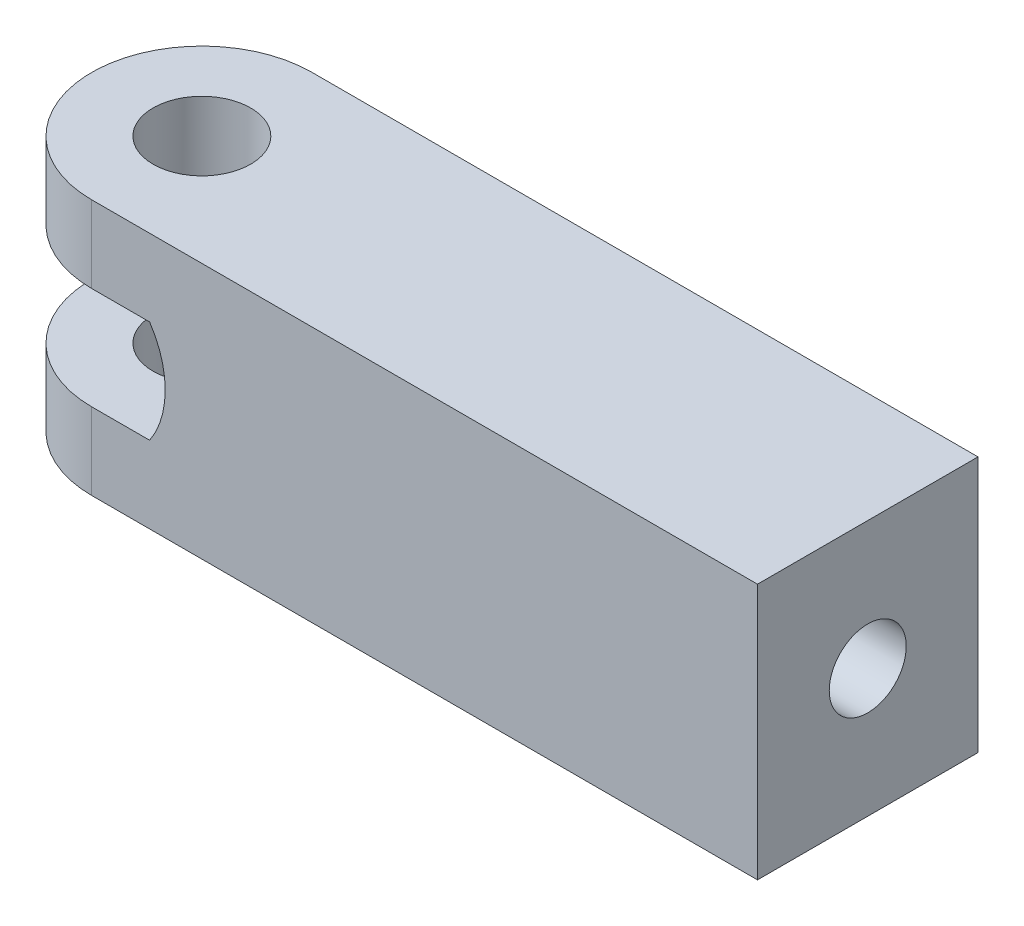
ISO-10303-21;
HEADER;
FILE_DESCRIPTION(('STEP AP214'),'2;1');
FILE_NAME('part.step','',(''),(''),'','','');
FILE_SCHEMA(('AUTOMOTIVE_DESIGN { 1 0 10303 214 1 1 1 1 }'));
ENDSEC;
DATA;
#1=APPLICATION_CONTEXT('core data for automotive mechanical design processes');
#2=APPLICATION_PROTOCOL_DEFINITION('international standard','automotive_design',2000,#1);
#3=PRODUCT_CONTEXT('',#1,'mechanical');
#4=PRODUCT('Part','Part','',(#3));
#5=PRODUCT_RELATED_PRODUCT_CATEGORY('part','',(#4));
#6=PRODUCT_DEFINITION_FORMATION('','',#4);
#7=PRODUCT_DEFINITION_CONTEXT('part definition',#1,'design');
#8=PRODUCT_DEFINITION('design','',#6,#7);
#9=PRODUCT_DEFINITION_SHAPE('','',#8);
#10=(LENGTH_UNIT() NAMED_UNIT(*) SI_UNIT(.MILLI.,.METRE.));
#11=(NAMED_UNIT(*) PLANE_ANGLE_UNIT() SI_UNIT($,.RADIAN.));
#12=(NAMED_UNIT(*) SI_UNIT($,.STERADIAN.) SOLID_ANGLE_UNIT());
#13=UNCERTAINTY_MEASURE_WITH_UNIT(LENGTH_MEASURE(1.E-05),#10,'distance_accuracy_value','');
#14=(GEOMETRIC_REPRESENTATION_CONTEXT(3) GLOBAL_UNCERTAINTY_ASSIGNED_CONTEXT((#13)) GLOBAL_UNIT_ASSIGNED_CONTEXT((#10,
#11,#12)) REPRESENTATION_CONTEXT('',''));
#15=CARTESIAN_POINT('',(0.,0.,0.));
#16=DIRECTION('',(0.,0.,1.));
#17=DIRECTION('',(1.,0.,0.));
#18=AXIS2_PLACEMENT_3D('',#15,#16,#17);
#19=CARTESIAN_POINT('',(0.,-12.5,-10.7625));
#20=DIRECTION('',(0.,0.,1.));
#21=DIRECTION('',(1.,0.,0.));
#22=AXIS2_PLACEMENT_3D('',#19,#20,#21);
#23=PLANE('',#22);
#24=DIRECTION('',(-1.,0.,0.));
#25=VECTOR('',#24,1.);
#26=CARTESIAN_POINT('',(0.,-5.,-10.7625));
#27=LINE('',#26,#25);
#28=CARTESIAN_POINT('',(5.66511846427175,-5.,-10.7625));
#29=VERTEX_POINT('',#28);
#30=CARTESIAN_POINT('',(0.,-5.,-10.7625));
#31=VERTEX_POINT('',#30);
#32=EDGE_CURVE('E320',#29,#31,#27,.T.);
#33=ORIENTED_EDGE('',*,*,#32,.F.);
#34=CARTESIAN_POINT('',(-1.79140714348278,0.,-10.7625));
#35=DIRECTION('',(0.,0.,1.));
#36=DIRECTION('',(1.,0.,0.));
#37=AXIS2_PLACEMENT_3D('',#34,#35,#36);
#38=CIRCLE('',#37,8.97773769605122);
#39=CARTESIAN_POINT('',(5.66511846427176,5.,-10.7625));
#40=VERTEX_POINT('',#39);
#41=EDGE_CURVE('E308',#40,#29,#38,.F.);
#42=ORIENTED_EDGE('',*,*,#41,.F.);
#43=DIRECTION('',(-1.,0.,0.));
#44=VECTOR('',#43,1.);
#45=CARTESIAN_POINT('',(0.,5.,-10.7625));
#46=LINE('',#45,#44);
#47=CARTESIAN_POINT('',(0.,5.,-10.7625));
#48=VERTEX_POINT('',#47);
#49=EDGE_CURVE('E316',#40,#48,#46,.T.);
#50=ORIENTED_EDGE('',*,*,#49,.T.);
#51=DIRECTION('',(0.,1.,0.));
#52=VECTOR('',#51,1.);
#53=CARTESIAN_POINT('',(0.,-12.5,-10.7625));
#54=LINE('',#53,#52);
#55=CARTESIAN_POINT('',(0.,12.5,-10.7625));
#56=VERTEX_POINT('',#55);
#57=EDGE_CURVE('E237',#48,#56,#54,.T.);
#58=ORIENTED_EDGE('',*,*,#57,.T.);
#59=DIRECTION('',(1.,0.,0.));
#60=VECTOR('',#59,1.);
#61=CARTESIAN_POINT('',(0.,12.5,-10.7625));
#62=LINE('',#61,#60);
#63=CARTESIAN_POINT('',(65.,12.5,-10.7625));
#64=VERTEX_POINT('',#63);
#65=EDGE_CURVE('E279',#56,#64,#62,.T.);
#66=ORIENTED_EDGE('',*,*,#65,.T.);
#67=DIRECTION('',(0.,1.,0.));
#68=VECTOR('',#67,1.);
#69=CARTESIAN_POINT('',(65.,-12.5,-10.7625));
#70=LINE('',#69,#68);
#71=CARTESIAN_POINT('',(65.,-12.5,-10.7625));
#72=VERTEX_POINT('',#71);
#73=EDGE_CURVE('E310',#72,#64,#70,.T.);
#74=ORIENTED_EDGE('',*,*,#73,.F.);
#75=DIRECTION('',(1.,0.,0.));
#76=VECTOR('',#75,1.);
#77=CARTESIAN_POINT('',(0.,-12.5,-10.7625));
#78=LINE('',#77,#76);
#79=CARTESIAN_POINT('',(0.,-12.5,-10.7625));
#80=VERTEX_POINT('',#79);
#81=EDGE_CURVE('E192',#80,#72,#78,.T.);
#82=ORIENTED_EDGE('',*,*,#81,.F.);
#83=EDGE_CURVE('E235',#80,#31,#54,.T.);
#84=ORIENTED_EDGE('',*,*,#83,.T.);
#85=EDGE_LOOP('',(#33,#42,#50,#58,#66,#74,#82,#84));
#86=FACE_BOUND('',#85,.T.);
#87=ADVANCED_FACE('F153',(#86),#23,.F.);
#88=CARTESIAN_POINT('',(0.,-12.5,10.7625));
#89=DIRECTION('',(0.,0.,1.));
#90=DIRECTION('',(1.,0.,0.));
#91=AXIS2_PLACEMENT_3D('',#88,#89,#90);
#92=PLANE('',#91);
#93=CARTESIAN_POINT('',(-1.79140714348278,0.,10.7625));
#94=DIRECTION('',(0.,0.,1.));
#95=DIRECTION('',(1.,0.,0.));
#96=AXIS2_PLACEMENT_3D('',#93,#94,#95);
#97=CIRCLE('',#96,8.97773769605122);
#98=CARTESIAN_POINT('',(5.66511846427176,5.,10.7625));
#99=VERTEX_POINT('',#98);
#100=CARTESIAN_POINT('',(5.66511846427175,-5.,10.7625));
#101=VERTEX_POINT('',#100);
#102=EDGE_CURVE('E12',#99,#101,#97,.F.);
#103=ORIENTED_EDGE('',*,*,#102,.T.);
#104=DIRECTION('',(-1.,0.,0.));
#105=VECTOR('',#104,1.);
#106=CARTESIAN_POINT('',(0.,-5.,10.7625));
#107=LINE('',#106,#105);
#108=CARTESIAN_POINT('',(0.,-5.,10.7625));
#109=VERTEX_POINT('',#108);
#110=EDGE_CURVE('E226',#101,#109,#107,.T.);
#111=ORIENTED_EDGE('',*,*,#110,.T.);
#112=DIRECTION('',(0.,1.,0.));
#113=VECTOR('',#112,1.);
#114=CARTESIAN_POINT('',(0.,-12.5,10.7625));
#115=LINE('',#114,#113);
#116=CARTESIAN_POINT('',(0.,-12.5,10.7625));
#117=VERTEX_POINT('',#116);
#118=EDGE_CURVE('E164',#117,#109,#115,.T.);
#119=ORIENTED_EDGE('',*,*,#118,.F.);
#120=DIRECTION('',(1.,0.,0.));
#121=VECTOR('',#120,1.);
#122=CARTESIAN_POINT('',(0.,-12.5,10.7625));
#123=LINE('',#122,#121);
#124=CARTESIAN_POINT('',(65.,-12.5,10.7625));
#125=VERTEX_POINT('',#124);
#126=EDGE_CURVE('E224',#117,#125,#123,.T.);
#127=ORIENTED_EDGE('',*,*,#126,.T.);
#128=DIRECTION('',(0.,-1.,0.));
#129=VECTOR('',#128,1.);
#130=CARTESIAN_POINT('',(65.,12.5,10.7625));
#131=LINE('',#130,#129);
#132=CARTESIAN_POINT('',(65.,12.5,10.7625));
#133=VERTEX_POINT('',#132);
#134=EDGE_CURVE('E300',#133,#125,#131,.T.);
#135=ORIENTED_EDGE('',*,*,#134,.F.);
#136=DIRECTION('',(1.,0.,0.));
#137=VECTOR('',#136,1.);
#138=CARTESIAN_POINT('',(0.,12.5,10.7625));
#139=LINE('',#138,#137);
#140=CARTESIAN_POINT('',(0.,12.5,10.7625));
#141=VERTEX_POINT('',#140);
#142=EDGE_CURVE('E283',#141,#133,#139,.T.);
#143=ORIENTED_EDGE('',*,*,#142,.F.);
#144=CARTESIAN_POINT('',(0.,5.,10.7625));
#145=VERTEX_POINT('',#144);
#146=EDGE_CURVE('E229',#145,#141,#115,.T.);
#147=ORIENTED_EDGE('',*,*,#146,.F.);
#148=DIRECTION('',(-1.,0.,0.));
#149=VECTOR('',#148,1.);
#150=CARTESIAN_POINT('',(0.,5.,10.7625));
#151=LINE('',#150,#149);
#152=EDGE_CURVE('E172',#99,#145,#151,.T.);
#153=ORIENTED_EDGE('',*,*,#152,.F.);
#154=EDGE_LOOP('',(#103,#111,#119,#127,#135,#143,#147,#153));
#155=FACE_BOUND('',#154,.T.);
#156=ADVANCED_FACE('F221',(#155),#92,.T.);
#157=CARTESIAN_POINT('',(0.,-12.5,0.));
#158=DIRECTION('',(0.,1.,0.));
#159=DIRECTION('',(0.,0.,1.));
#160=AXIS2_PLACEMENT_3D('',#157,#158,#159);
#161=CYLINDRICAL_SURFACE('',#160,10.7625);
#162=CARTESIAN_POINT('',(0.,-5.,0.));
#163=DIRECTION('',(0.,1.,0.));
#164=DIRECTION('',(-1.,0.,0.));
#165=AXIS2_PLACEMENT_3D('',#162,#163,#164);
#166=CIRCLE('',#165,10.7625);
#167=EDGE_CURVE('E258',#109,#31,#166,.F.);
#168=ORIENTED_EDGE('',*,*,#167,.T.);
#169=ORIENTED_EDGE('',*,*,#83,.F.);
#170=CARTESIAN_POINT('',(0.,-12.5,0.));
#171=DIRECTION('',(0.,1.,0.));
#172=DIRECTION('',(0.,0.,1.));
#173=AXIS2_PLACEMENT_3D('',#170,#171,#172);
#174=CIRCLE('',#173,10.7625);
#175=EDGE_CURVE('E232',#80,#117,#174,.T.);
#176=ORIENTED_EDGE('',*,*,#175,.T.);
#177=ORIENTED_EDGE('',*,*,#118,.T.);
#178=EDGE_LOOP('',(#168,#169,#176,#177));
#179=FACE_BOUND('',#178,.T.);
#180=ADVANCED_FACE('F233',(#179),#161,.T.);
#181=CARTESIAN_POINT('',(0.,-12.5,0.));
#182=DIRECTION('',(0.,1.,0.));
#183=DIRECTION('',(0.,0.,1.));
#184=AXIS2_PLACEMENT_3D('',#181,#182,#183);
#185=CYLINDRICAL_SURFACE('',#184,4.7625);
#186=CARTESIAN_POINT('',(0.,-12.5,0.));
#187=DIRECTION('',(0.,1.,0.));
#188=DIRECTION('',(0.,0.,1.));
#189=AXIS2_PLACEMENT_3D('',#186,#187,#188);
#190=CIRCLE('',#189,4.7625);
#191=CARTESIAN_POINT('',(0.,-12.5,4.7625));
#192=VERTEX_POINT('',#191);
#193=EDGE_CURVE('E271',#192,#192,#190,.T.);
#194=ORIENTED_EDGE('',*,*,#193,.F.);
#195=EDGE_LOOP('',(#194));
#196=FACE_BOUND('',#195,.T.);
#197=CARTESIAN_POINT('',(0.,-5.,0.));
#198=DIRECTION('',(0.,1.,0.));
#199=DIRECTION('',(-1.,0.,0.));
#200=AXIS2_PLACEMENT_3D('',#197,#198,#199);
#201=CIRCLE('',#200,4.7625);
#202=CARTESIAN_POINT('',(-4.7625,-5.,0.));
#203=VERTEX_POINT('',#202);
#204=EDGE_CURVE('E255',#203,#203,#201,.F.);
#205=ORIENTED_EDGE('',*,*,#204,.F.);
#206=EDGE_LOOP('',(#205));
#207=FACE_BOUND('',#206,.T.);
#208=ADVANCED_FACE('F369',(#196,#207),#185,.F.);
#209=CARTESIAN_POINT('',(0.,12.5,0.));
#210=DIRECTION('',(0.,1.,0.));
#211=DIRECTION('',(0.,0.,1.));
#212=AXIS2_PLACEMENT_3D('',#209,#210,#211);
#213=PLANE('',#212);
#214=CARTESIAN_POINT('',(0.,12.5,0.));
#215=DIRECTION('',(0.,1.,0.));
#216=DIRECTION('',(0.,0.,1.));
#217=AXIS2_PLACEMENT_3D('',#214,#215,#216);
#218=CIRCLE('',#217,4.7625);
#219=CARTESIAN_POINT('',(0.,12.5,4.7625));
#220=VERTEX_POINT('',#219);
#221=EDGE_CURVE('E275',#220,#220,#218,.T.);
#222=ORIENTED_EDGE('',*,*,#221,.F.);
#223=EDGE_LOOP('',(#222));
#224=FACE_BOUND('',#223,.T.);
#225=ORIENTED_EDGE('',*,*,#65,.F.);
#226=CARTESIAN_POINT('',(0.,12.5,0.));
#227=DIRECTION('',(0.,1.,0.));
#228=DIRECTION('',(0.,0.,1.));
#229=AXIS2_PLACEMENT_3D('',#226,#227,#228);
#230=CIRCLE('',#229,10.7625);
#231=EDGE_CURVE('E243',#56,#141,#230,.T.);
#232=ORIENTED_EDGE('',*,*,#231,.T.);
#233=ORIENTED_EDGE('',*,*,#142,.T.);
#234=DIRECTION('',(0.,0.,1.));
#235=VECTOR('',#234,1.);
#236=CARTESIAN_POINT('',(65.,12.5,-10.7625));
#237=LINE('',#236,#235);
#238=EDGE_CURVE('E304',#64,#133,#237,.T.);
#239=ORIENTED_EDGE('',*,*,#238,.F.);
#240=EDGE_LOOP('',(#225,#232,#233,#239));
#241=FACE_BOUND('',#240,.T.);
#242=ADVANCED_FACE('F291',(#224,#241),#213,.T.);
#243=CARTESIAN_POINT('',(0.,-12.5,0.));
#244=DIRECTION('',(0.,1.,0.));
#245=DIRECTION('',(0.,0.,1.));
#246=AXIS2_PLACEMENT_3D('',#243,#244,#245);
#247=PLANE('',#246);
#248=ORIENTED_EDGE('',*,*,#193,.T.);
#249=EDGE_LOOP('',(#248));
#250=FACE_BOUND('',#249,.T.);
#251=ORIENTED_EDGE('',*,*,#175,.F.);
#252=ORIENTED_EDGE('',*,*,#81,.T.);
#253=DIRECTION('',(0.,0.,-1.));
#254=VECTOR('',#253,1.);
#255=CARTESIAN_POINT('',(65.,-12.5,10.7625));
#256=LINE('',#255,#254);
#257=EDGE_CURVE('E239',#125,#72,#256,.T.);
#258=ORIENTED_EDGE('',*,*,#257,.F.);
#259=ORIENTED_EDGE('',*,*,#126,.F.);
#260=EDGE_LOOP('',(#251,#252,#258,#259));
#261=FACE_BOUND('',#260,.T.);
#262=ADVANCED_FACE('F155',(#250,#261),#247,.F.);
#263=ORIENTED_EDGE('',*,*,#57,.F.);
#264=CARTESIAN_POINT('',(0.,5.,0.));
#265=DIRECTION('',(0.,1.,0.));
#266=DIRECTION('',(-1.,0.,0.));
#267=AXIS2_PLACEMENT_3D('',#264,#265,#266);
#268=CIRCLE('',#267,10.7625);
#269=EDGE_CURVE('E253',#145,#48,#268,.F.);
#270=ORIENTED_EDGE('',*,*,#269,.F.);
#271=ORIENTED_EDGE('',*,*,#146,.T.);
#272=ORIENTED_EDGE('',*,*,#231,.F.);
#273=EDGE_LOOP('',(#263,#270,#271,#272));
#274=FACE_BOUND('',#273,.T.);
#275=ADVANCED_FACE('F297',(#274),#161,.T.);
#276=CARTESIAN_POINT('',(0.,5.,0.));
#277=DIRECTION('',(0.,1.,0.));
#278=DIRECTION('',(-1.,0.,0.));
#279=AXIS2_PLACEMENT_3D('',#276,#277,#278);
#280=CIRCLE('',#279,4.7625);
#281=CARTESIAN_POINT('',(-4.7625,5.,0.));
#282=VERTEX_POINT('',#281);
#283=EDGE_CURVE('E249',#282,#282,#280,.F.);
#284=ORIENTED_EDGE('',*,*,#283,.T.);
#285=EDGE_LOOP('',(#284));
#286=FACE_BOUND('',#285,.T.);
#287=ORIENTED_EDGE('',*,*,#221,.T.);
#288=EDGE_LOOP('',(#287));
#289=FACE_BOUND('',#288,.T.);
#290=ADVANCED_FACE('F378',(#286,#289),#185,.F.);
#291=CARTESIAN_POINT('',(0.,-5.,-10.7625));
#292=DIRECTION('',(0.,1.,0.));
#293=DIRECTION('',(-1.,0.,0.));
#294=AXIS2_PLACEMENT_3D('',#291,#292,#293);
#295=PLANE('',#294);
#296=DIRECTION('',(0.,0.,1.));
#297=VECTOR('',#296,1.);
#298=CARTESIAN_POINT('',(5.66511846427175,-5.,-10.7625));
#299=LINE('',#298,#297);
#300=EDGE_CURVE('E254',#29,#101,#299,.T.);
#301=ORIENTED_EDGE('',*,*,#300,.F.);
#302=ORIENTED_EDGE('',*,*,#32,.T.);
#303=ORIENTED_EDGE('',*,*,#167,.F.);
#304=ORIENTED_EDGE('',*,*,#110,.F.);
#305=EDGE_LOOP('',(#301,#302,#303,#304));
#306=FACE_BOUND('',#305,.T.);
#307=ORIENTED_EDGE('',*,*,#204,.T.);
#308=EDGE_LOOP('',(#307));
#309=FACE_BOUND('',#308,.T.);
#310=ADVANCED_FACE('F332',(#306,#309),#295,.T.);
#311=CARTESIAN_POINT('',(0.,5.,-10.7625));
#312=DIRECTION('',(0.,1.,0.));
#313=DIRECTION('',(-1.,0.,0.));
#314=AXIS2_PLACEMENT_3D('',#311,#312,#313);
#315=PLANE('',#314);
#316=ORIENTED_EDGE('',*,*,#152,.T.);
#317=ORIENTED_EDGE('',*,*,#269,.T.);
#318=ORIENTED_EDGE('',*,*,#49,.F.);
#319=DIRECTION('',(0.,0.,1.));
#320=VECTOR('',#319,1.);
#321=CARTESIAN_POINT('',(5.66511846427176,5.,-10.7625));
#322=LINE('',#321,#320);
#323=EDGE_CURVE('E324',#40,#99,#322,.T.);
#324=ORIENTED_EDGE('',*,*,#323,.T.);
#325=EDGE_LOOP('',(#316,#317,#318,#324));
#326=FACE_BOUND('',#325,.T.);
#327=ORIENTED_EDGE('',*,*,#283,.F.);
#328=EDGE_LOOP('',(#327));
#329=FACE_BOUND('',#328,.T.);
#330=ADVANCED_FACE('F387',(#326,#329),#315,.F.);
#331=CARTESIAN_POINT('',(-1.79140714348278,0.,-10.7625));
#332=DIRECTION('',(0.,0.,1.));
#333=DIRECTION('',(1.,0.,0.));
#334=AXIS2_PLACEMENT_3D('',#331,#332,#333);
#335=CYLINDRICAL_SURFACE('',#334,8.97773769605122);
#336=ORIENTED_EDGE('',*,*,#323,.F.);
#337=ORIENTED_EDGE('',*,*,#41,.T.);
#338=ORIENTED_EDGE('',*,*,#300,.T.);
#339=ORIENTED_EDGE('',*,*,#102,.F.);
#340=EDGE_LOOP('',(#336,#337,#338,#339));
#341=FACE_BOUND('',#340,.T.);
#342=ADVANCED_FACE('F328',(#341),#335,.F.);
#343=CARTESIAN_POINT('',(65.,0.,0.));
#344=DIRECTION('',(1.,0.,0.));
#345=DIRECTION('',(0.,0.,-1.));
#346=AXIS2_PLACEMENT_3D('',#343,#344,#345);
#347=PLANE('',#346);
#348=CARTESIAN_POINT('',(65.,0.,0.));
#349=DIRECTION('',(1.,0.,0.));
#350=DIRECTION('',(0.,0.,-1.));
#351=AXIS2_PLACEMENT_3D('',#348,#349,#350);
#352=CIRCLE('',#351,3.7592);
#353=CARTESIAN_POINT('',(65.,0.,3.7592));
#354=VERTEX_POINT('',#353);
#355=EDGE_CURVE('E157',#354,#354,#352,.F.);
#356=ORIENTED_EDGE('',*,*,#355,.T.);
#357=EDGE_LOOP('',(#356));
#358=FACE_BOUND('',#357,.T.);
#359=ORIENTED_EDGE('',*,*,#73,.T.);
#360=ORIENTED_EDGE('',*,*,#238,.T.);
#361=ORIENTED_EDGE('',*,*,#134,.T.);
#362=ORIENTED_EDGE('',*,*,#257,.T.);
#363=EDGE_LOOP('',(#359,#360,#361,#362));
#364=FACE_BOUND('',#363,.T.);
#365=ADVANCED_FACE('F349',(#358,#364),#347,.T.);
#366=CARTESIAN_POINT('',(65.000012,0.,0.));
#367=DIRECTION('',(-1.,0.,0.));
#368=DIRECTION('',(0.,0.,1.));
#369=AXIS2_PLACEMENT_3D('',#366,#367,#368);
#370=CYLINDRICAL_SURFACE('',#369,3.7592);
#371=CARTESIAN_POINT('',(55.,0.,0.));
#372=DIRECTION('',(1.,0.,0.));
#373=DIRECTION('',(0.,0.,-1.));
#374=AXIS2_PLACEMENT_3D('',#371,#372,#373);
#375=CIRCLE('',#374,3.7592);
#376=CARTESIAN_POINT('',(55.,0.,3.7592));
#377=VERTEX_POINT('',#376);
#378=EDGE_CURVE('E339',#377,#377,#375,.T.);
#379=CARTESIAN_POINT('',(65.,0.,3.7592));
#380=CARTESIAN_POINT('',(64.8958333333333,0.,3.7592));
#381=CARTESIAN_POINT('',(64.7916666666667,0.,3.7592));
#382=CARTESIAN_POINT('',(64.5833333333333,0.,3.7592));
#383=CARTESIAN_POINT('',(64.4791666666667,0.,3.7592));
#384=CARTESIAN_POINT('',(64.2708333333333,0.,3.7592));
#385=CARTESIAN_POINT('',(64.1666666666667,0.,3.7592));
#386=CARTESIAN_POINT('',(63.9583333333333,0.,3.7592));
#387=CARTESIAN_POINT('',(63.8541666666667,0.,3.7592));
#388=CARTESIAN_POINT('',(63.6458333333333,0.,3.7592));
#389=CARTESIAN_POINT('',(63.5416666666667,0.,3.7592));
#390=CARTESIAN_POINT('',(63.3333333333333,0.,3.7592));
#391=CARTESIAN_POINT('',(63.2291666666667,0.,3.7592));
#392=CARTESIAN_POINT('',(63.0208333333333,0.,3.7592));
#393=CARTESIAN_POINT('',(62.9166666666667,0.,3.7592));
#394=CARTESIAN_POINT('',(62.7083333333333,0.,3.7592));
#395=CARTESIAN_POINT('',(62.6041666666667,0.,3.7592));
#396=CARTESIAN_POINT('',(62.3958333333333,0.,3.7592));
#397=CARTESIAN_POINT('',(62.2916666666667,0.,3.7592));
#398=CARTESIAN_POINT('',(62.0833333333333,0.,3.7592));
#399=CARTESIAN_POINT('',(61.9791666666667,0.,3.7592));
#400=CARTESIAN_POINT('',(61.7708333333333,0.,3.7592));
#401=CARTESIAN_POINT('',(61.6666666666667,0.,3.7592));
#402=CARTESIAN_POINT('',(61.4583333333333,0.,3.7592));
#403=CARTESIAN_POINT('',(61.3541666666667,0.,3.7592));
#404=CARTESIAN_POINT('',(61.1458333333333,0.,3.7592));
#405=CARTESIAN_POINT('',(61.0416666666667,0.,3.7592));
#406=CARTESIAN_POINT('',(60.8333333333333,0.,3.7592));
#407=CARTESIAN_POINT('',(60.7291666666667,0.,3.7592));
#408=CARTESIAN_POINT('',(60.5208333333333,0.,3.7592));
#409=CARTESIAN_POINT('',(60.4166666666667,0.,3.7592));
#410=CARTESIAN_POINT('',(60.2083333333333,0.,3.7592));
#411=CARTESIAN_POINT('',(60.1041666666667,0.,3.7592));
#412=CARTESIAN_POINT('',(59.8958333333333,0.,3.7592));
#413=CARTESIAN_POINT('',(59.7916666666667,0.,3.7592));
#414=CARTESIAN_POINT('',(59.5833333333333,0.,3.7592));
#415=CARTESIAN_POINT('',(59.4791666666667,0.,3.7592));
#416=CARTESIAN_POINT('',(59.2708333333333,0.,3.7592));
#417=CARTESIAN_POINT('',(59.1666666666667,0.,3.7592));
#418=CARTESIAN_POINT('',(58.9583333333333,0.,3.7592));
#419=CARTESIAN_POINT('',(58.8541666666667,0.,3.7592));
#420=CARTESIAN_POINT('',(58.6458333333333,0.,3.7592));
#421=CARTESIAN_POINT('',(58.5416666666667,0.,3.7592));
#422=CARTESIAN_POINT('',(58.3333333333333,0.,3.7592));
#423=CARTESIAN_POINT('',(58.2291666666667,0.,3.7592));
#424=CARTESIAN_POINT('',(58.0208333333333,0.,3.7592));
#425=CARTESIAN_POINT('',(57.9166666666667,0.,3.7592));
#426=CARTESIAN_POINT('',(57.7083333333333,0.,3.7592));
#427=CARTESIAN_POINT('',(57.6041666666667,0.,3.7592));
#428=CARTESIAN_POINT('',(57.3958333333333,0.,3.7592));
#429=CARTESIAN_POINT('',(57.2916666666667,0.,3.7592));
#430=CARTESIAN_POINT('',(57.0833333333333,0.,3.7592));
#431=CARTESIAN_POINT('',(56.9791666666667,0.,3.7592));
#432=CARTESIAN_POINT('',(56.7708333333333,0.,3.7592));
#433=CARTESIAN_POINT('',(56.6666666666667,0.,3.7592));
#434=CARTESIAN_POINT('',(56.4583333333333,0.,3.7592));
#435=CARTESIAN_POINT('',(56.3541666666667,0.,3.7592));
#436=CARTESIAN_POINT('',(56.1458333333333,0.,3.7592));
#437=CARTESIAN_POINT('',(56.0416666666667,0.,3.7592));
#438=CARTESIAN_POINT('',(55.8333333333333,0.,3.7592));
#439=CARTESIAN_POINT('',(55.7291666666667,0.,3.7592));
#440=CARTESIAN_POINT('',(55.5208333333333,0.,3.7592));
#441=CARTESIAN_POINT('',(55.4166666666667,0.,3.7592));
#442=CARTESIAN_POINT('',(55.2083333333333,0.,3.7592));
#443=CARTESIAN_POINT('',(55.1041666666667,0.,3.7592));
#444=CARTESIAN_POINT('',(55.,0.,3.7592));
#445=B_SPLINE_CURVE_WITH_KNOTS('',3,(#379,#380,#381,#382,#383,#384,#385,#386,#387,#388,#389,
#390,#391,#392,#393,#394,#395,#396,#397,#398,#399,#400,#401,#402,#403,#404,#405,#406,#407,#408,
#409,#410,#411,#412,#413,#414,#415,#416,#417,#418,#419,#420,#421,#422,#423,#424,#425,#426,#427,
#428,#429,#430,#431,#432,#433,#434,#435,#436,#437,#438,#439,#440,#441,#442,#443,#444),
.UNSPECIFIED.,.F.,.F.,(4,2,2,2,2,2,2,2,2,2,2,2,2,2,2,2,2,2,2,2,2,2,2,2,2,2,2,2,2,2,2,2,4),(0.,
0.312499999999993,0.624999999999987,0.937499999999994,1.24999999999999,1.56249999999999,
1.87499999999999,2.1875,2.5,2.8125,3.12499999999999,3.43749999999999,3.74999999999999,
4.06249999999999,4.37499999999999,4.68749999999999,4.99999999999999,5.31249999999999,
5.62499999999999,5.93749999999999,6.24999999999999,6.56249999999999,6.87499999999999,
7.18749999999999,7.49999999999999,7.81249999999999,8.12499999999999,8.43749999999999,
8.74999999999999,9.06249999999999,9.37499999999999,9.68749999999999,9.99999999999999),.UNSPECIFIED.);
#446=EDGE_CURVE('BSEAM347',#354,#377,#445,.T.);
#447=ORIENTED_EDGE('',*,*,#355,.F.);
#448=ORIENTED_EDGE('',*,*,#378,.F.);
#449=ORIENTED_EDGE('',*,*,#446,.T.);
#450=ORIENTED_EDGE('',*,*,#446,.F.);
#451=EDGE_LOOP('',(#447,#449,#448,#450));
#452=FACE_BOUND('',#451,.T.);
#453=ADVANCED_FACE('F347',(#452),#370,.F.);
#454=CARTESIAN_POINT('',(55.,0.,0.));
#455=DIRECTION('',(1.,0.,0.));
#456=DIRECTION('',(0.,0.,-1.));
#457=AXIS2_PLACEMENT_3D('',#454,#455,#456);
#458=PLANE('',#457);
#459=ORIENTED_EDGE('',*,*,#378,.T.);
#460=EDGE_LOOP('',(#459));
#461=FACE_BOUND('',#460,.T.);
#462=ADVANCED_FACE('F345',(#461),#458,.T.);
#463=CLOSED_SHELL('',(#87,#156,#180,#208,#242,#262,#275,#290,#310,#330,#342,#365,#453,#462));
#464=MANIFOLD_SOLID_BREP('B2',#463);
#465=ADVANCED_BREP_SHAPE_REPRESENTATION('',(#18,#464),#14);
#466=SHAPE_DEFINITION_REPRESENTATION(#9,#465);
ENDSEC;
END-ISO-10303-21;
